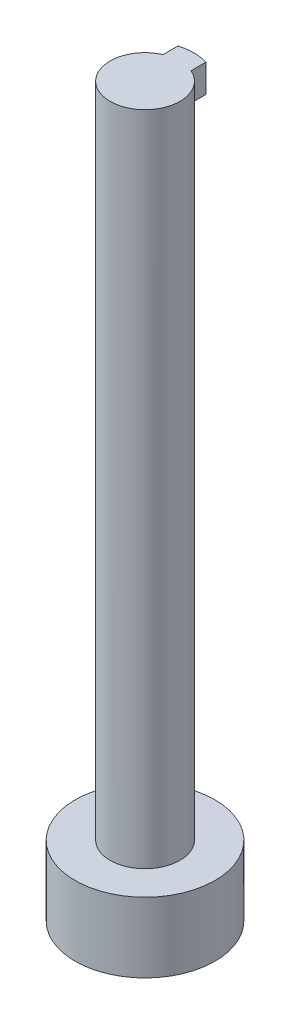
ISO-10303-21;
HEADER;
FILE_DESCRIPTION(('STEP AP214'),'2;1');
FILE_NAME('part.step','',(''),(''),'','','');
FILE_SCHEMA(('AUTOMOTIVE_DESIGN { 1 0 10303 214 1 1 1 1 }'));
ENDSEC;
DATA;
#1=APPLICATION_CONTEXT('core data for automotive mechanical design processes');
#2=APPLICATION_PROTOCOL_DEFINITION('international standard','automotive_design',2000,#1);
#3=PRODUCT_CONTEXT('',#1,'mechanical');
#4=PRODUCT('Part','Part','',(#3));
#5=PRODUCT_RELATED_PRODUCT_CATEGORY('part','',(#4));
#6=PRODUCT_DEFINITION_FORMATION('','',#4);
#7=PRODUCT_DEFINITION_CONTEXT('part definition',#1,'design');
#8=PRODUCT_DEFINITION('design','',#6,#7);
#9=PRODUCT_DEFINITION_SHAPE('','',#8);
#10=(LENGTH_UNIT() NAMED_UNIT(*) SI_UNIT(.MILLI.,.METRE.));
#11=(NAMED_UNIT(*) PLANE_ANGLE_UNIT() SI_UNIT($,.RADIAN.));
#12=(NAMED_UNIT(*) SI_UNIT($,.STERADIAN.) SOLID_ANGLE_UNIT());
#13=UNCERTAINTY_MEASURE_WITH_UNIT(LENGTH_MEASURE(1.E-05),#10,'distance_accuracy_value','');
#14=(GEOMETRIC_REPRESENTATION_CONTEXT(3) GLOBAL_UNCERTAINTY_ASSIGNED_CONTEXT((#13)) GLOBAL_UNIT_ASSIGNED_CONTEXT((#10,
#11,#12)) REPRESENTATION_CONTEXT('',''));
#15=CARTESIAN_POINT('',(0.,0.,0.));
#16=DIRECTION('',(0.,0.,1.));
#17=DIRECTION('',(1.,0.,0.));
#18=AXIS2_PLACEMENT_3D('',#15,#16,#17);
#19=CARTESIAN_POINT('',(0.,66.04,0.));
#20=DIRECTION('',(0.,-1.,0.));
#21=DIRECTION('',(0.,0.,-1.));
#22=AXIS2_PLACEMENT_3D('',#19,#20,#21);
#23=CYLINDRICAL_SURFACE('',#22,3.175);
#24=CARTESIAN_POINT('',(0.,63.5,0.));
#25=DIRECTION('',(0.,-1.,0.));
#26=DIRECTION('',(0.,0.,1.));
#27=AXIS2_PLACEMENT_3D('',#24,#25,#26);
#28=CIRCLE('',#27,3.175);
#29=CARTESIAN_POINT('',(-1.27,63.5,-2.90993556629696));
#30=VERTEX_POINT('',#29);
#31=CARTESIAN_POINT('',(1.27,63.5,-2.90993556629696));
#32=VERTEX_POINT('',#31);
#33=EDGE_CURVE('E93',#30,#32,#28,.T.);
#34=ORIENTED_EDGE('',*,*,#33,.T.);
#35=DIRECTION('',(0.,1.,0.));
#36=VECTOR('',#35,1.);
#37=CARTESIAN_POINT('',(1.27,63.5,-2.90993556629696));
#38=LINE('',#37,#36);
#39=CARTESIAN_POINT('',(1.27,66.04,-2.90993556629696));
#40=VERTEX_POINT('',#39);
#41=EDGE_CURVE('E107',#32,#40,#38,.T.);
#42=ORIENTED_EDGE('',*,*,#41,.T.);
#43=CARTESIAN_POINT('',(0.,66.04,0.));
#44=DIRECTION('',(0.,1.,0.));
#45=DIRECTION('',(0.,0.,1.));
#46=AXIS2_PLACEMENT_3D('',#43,#44,#45);
#47=CIRCLE('',#46,3.175);
#48=CARTESIAN_POINT('',(-1.27,66.04,-2.90993556629696));
#49=VERTEX_POINT('',#48);
#50=EDGE_CURVE('E51',#49,#40,#47,.T.);
#51=ORIENTED_EDGE('',*,*,#50,.F.);
#52=DIRECTION('',(0.,1.,0.));
#53=VECTOR('',#52,1.);
#54=CARTESIAN_POINT('',(-1.27,63.5,-2.90993556629696));
#55=LINE('',#54,#53);
#56=EDGE_CURVE('E102',#30,#49,#55,.T.);
#57=ORIENTED_EDGE('',*,*,#56,.F.);
#58=EDGE_LOOP('',(#34,#42,#51,#57));
#59=FACE_BOUND('',#58,.T.);
#60=CARTESIAN_POINT('',(0.,6.35,0.));
#61=DIRECTION('',(0.,-1.,0.));
#62=DIRECTION('',(0.,0.,-1.));
#63=AXIS2_PLACEMENT_3D('',#60,#61,#62);
#64=CIRCLE('',#63,3.175);
#65=CARTESIAN_POINT('',(0.,6.35,-3.175));
#66=VERTEX_POINT('',#65);
#67=EDGE_CURVE('E13',#66,#66,#64,.T.);
#68=ORIENTED_EDGE('',*,*,#67,.F.);
#69=EDGE_LOOP('',(#68));
#70=FACE_BOUND('',#69,.T.);
#71=ADVANCED_FACE('F44',(#59,#70),#23,.T.);
#72=CARTESIAN_POINT('',(0.,66.04,0.));
#73=DIRECTION('',(0.,1.,0.));
#74=DIRECTION('',(0.,0.,1.));
#75=AXIS2_PLACEMENT_3D('',#72,#73,#74);
#76=PLANE('',#75);
#77=ORIENTED_EDGE('',*,*,#50,.T.);
#78=DIRECTION('',(0.,0.,-1.));
#79=VECTOR('',#78,1.);
#80=CARTESIAN_POINT('',(1.27,66.04,-4.2597094971371));
#81=LINE('',#80,#79);
#82=CARTESIAN_POINT('',(1.27,66.04,-4.2597094971371));
#83=VERTEX_POINT('',#82);
#84=EDGE_CURVE('E114',#40,#83,#81,.T.);
#85=ORIENTED_EDGE('',*,*,#84,.T.);
#86=CARTESIAN_POINT('',(0.,66.04,0.));
#87=DIRECTION('',(0.,1.,0.));
#88=DIRECTION('',(0.,0.,1.));
#89=AXIS2_PLACEMENT_3D('',#86,#87,#88);
#90=CIRCLE('',#89,4.445);
#91=CARTESIAN_POINT('',(-1.27,66.04,-4.2597094971371));
#92=VERTEX_POINT('',#91);
#93=EDGE_CURVE('E117',#83,#92,#90,.T.);
#94=ORIENTED_EDGE('',*,*,#93,.T.);
#95=DIRECTION('',(0.,0.,1.));
#96=VECTOR('',#95,1.);
#97=CARTESIAN_POINT('',(-1.27,66.04,-4.2597094971371));
#98=LINE('',#97,#96);
#99=EDGE_CURVE('E58',#92,#49,#98,.T.);
#100=ORIENTED_EDGE('',*,*,#99,.T.);
#101=EDGE_LOOP('',(#77,#85,#94,#100));
#102=FACE_BOUND('',#101,.T.);
#103=ADVANCED_FACE('F143',(#102),#76,.T.);
#104=CARTESIAN_POINT('',(0.,63.5,0.));
#105=DIRECTION('',(0.,1.,0.));
#106=DIRECTION('',(0.,0.,1.));
#107=AXIS2_PLACEMENT_3D('',#104,#105,#106);
#108=CYLINDRICAL_SURFACE('',#107,4.445);
#109=ORIENTED_EDGE('',*,*,#93,.F.);
#110=DIRECTION('',(0.,1.,0.));
#111=VECTOR('',#110,1.);
#112=CARTESIAN_POINT('',(1.27,63.5,-4.2597094971371));
#113=LINE('',#112,#111);
#114=CARTESIAN_POINT('',(1.27,63.5,-4.2597094971371));
#115=VERTEX_POINT('',#114);
#116=EDGE_CURVE('E67',#115,#83,#113,.T.);
#117=ORIENTED_EDGE('',*,*,#116,.F.);
#118=CARTESIAN_POINT('',(0.,63.5,0.));
#119=DIRECTION('',(0.,1.,0.));
#120=DIRECTION('',(0.,0.,1.));
#121=AXIS2_PLACEMENT_3D('',#118,#119,#120);
#122=CIRCLE('',#121,4.445);
#123=CARTESIAN_POINT('',(-1.27,63.5,-4.2597094971371));
#124=VERTEX_POINT('',#123);
#125=EDGE_CURVE('E104',#115,#124,#122,.T.);
#126=ORIENTED_EDGE('',*,*,#125,.T.);
#127=DIRECTION('',(0.,1.,0.));
#128=VECTOR('',#127,1.);
#129=CARTESIAN_POINT('',(-1.27,63.5,-4.2597094971371));
#130=LINE('',#129,#128);
#131=EDGE_CURVE('E87',#124,#92,#130,.T.);
#132=ORIENTED_EDGE('',*,*,#131,.T.);
#133=EDGE_LOOP('',(#109,#117,#126,#132));
#134=FACE_BOUND('',#133,.T.);
#135=ADVANCED_FACE('F147',(#134),#108,.T.);
#136=CARTESIAN_POINT('',(1.27,63.5,-4.2597094971371));
#137=DIRECTION('',(1.,0.,0.));
#138=DIRECTION('',(0.,0.,-1.));
#139=AXIS2_PLACEMENT_3D('',#136,#137,#138);
#140=PLANE('',#139);
#141=ORIENTED_EDGE('',*,*,#84,.F.);
#142=ORIENTED_EDGE('',*,*,#41,.F.);
#143=DIRECTION('',(0.,0.,-1.));
#144=VECTOR('',#143,1.);
#145=CARTESIAN_POINT('',(1.27,63.5,-4.2597094971371));
#146=LINE('',#145,#144);
#147=EDGE_CURVE('E96',#32,#115,#146,.T.);
#148=ORIENTED_EDGE('',*,*,#147,.T.);
#149=ORIENTED_EDGE('',*,*,#116,.T.);
#150=EDGE_LOOP('',(#141,#142,#148,#149));
#151=FACE_BOUND('',#150,.T.);
#152=ADVANCED_FACE('F152',(#151),#140,.T.);
#153=CARTESIAN_POINT('',(-1.27,63.5,-4.2597094971371));
#154=DIRECTION('',(-1.,0.,0.));
#155=DIRECTION('',(0.,0.,1.));
#156=AXIS2_PLACEMENT_3D('',#153,#154,#155);
#157=PLANE('',#156);
#158=ORIENTED_EDGE('',*,*,#99,.F.);
#159=ORIENTED_EDGE('',*,*,#131,.F.);
#160=DIRECTION('',(0.,0.,1.));
#161=VECTOR('',#160,1.);
#162=CARTESIAN_POINT('',(-1.27,63.5,-4.2597094971371));
#163=LINE('',#162,#161);
#164=EDGE_CURVE('E95',#124,#30,#163,.T.);
#165=ORIENTED_EDGE('',*,*,#164,.T.);
#166=ORIENTED_EDGE('',*,*,#56,.T.);
#167=EDGE_LOOP('',(#158,#159,#165,#166));
#168=FACE_BOUND('',#167,.T.);
#169=ADVANCED_FACE('F101',(#168),#157,.T.);
#170=CARTESIAN_POINT('',(0.,63.5,0.));
#171=DIRECTION('',(0.,1.,0.));
#172=DIRECTION('',(0.,0.,1.));
#173=AXIS2_PLACEMENT_3D('',#170,#171,#172);
#174=PLANE('',#173);
#175=ORIENTED_EDGE('',*,*,#125,.F.);
#176=ORIENTED_EDGE('',*,*,#147,.F.);
#177=ORIENTED_EDGE('',*,*,#33,.F.);
#178=ORIENTED_EDGE('',*,*,#164,.F.);
#179=EDGE_LOOP('',(#175,#176,#177,#178));
#180=FACE_BOUND('',#179,.T.);
#181=ADVANCED_FACE('F94',(#180),#174,.F.);
#182=CARTESIAN_POINT('',(0.,6.35,0.));
#183=DIRECTION('',(0.,-1.,0.));
#184=DIRECTION('',(0.,0.,-1.));
#185=AXIS2_PLACEMENT_3D('',#182,#183,#184);
#186=CYLINDRICAL_SURFACE('',#185,6.35);
#187=CARTESIAN_POINT('',(0.,6.35,0.));
#188=DIRECTION('',(0.,-1.,0.));
#189=DIRECTION('',(0.,0.,-1.));
#190=AXIS2_PLACEMENT_3D('',#187,#188,#189);
#191=CIRCLE('',#190,6.35);
#192=CARTESIAN_POINT('',(0.,6.35,-6.35));
#193=VERTEX_POINT('',#192);
#194=EDGE_CURVE('E119',#193,#193,#191,.T.);
#195=ORIENTED_EDGE('',*,*,#194,.T.);
#196=EDGE_LOOP('',(#195));
#197=FACE_BOUND('',#196,.T.);
#198=CARTESIAN_POINT('',(0.,0.,0.));
#199=DIRECTION('',(0.,-1.,0.));
#200=DIRECTION('',(0.,0.,-1.));
#201=AXIS2_PLACEMENT_3D('',#198,#199,#200);
#202=CIRCLE('',#201,6.35);
#203=CARTESIAN_POINT('',(0.,0.,-6.35));
#204=VERTEX_POINT('',#203);
#205=EDGE_CURVE('E122',#204,#204,#202,.T.);
#206=ORIENTED_EDGE('',*,*,#205,.F.);
#207=EDGE_LOOP('',(#206));
#208=FACE_BOUND('',#207,.T.);
#209=ADVANCED_FACE('F128',(#197,#208),#186,.T.);
#210=CARTESIAN_POINT('',(0.,6.35,0.));
#211=DIRECTION('',(0.,-1.,0.));
#212=DIRECTION('',(0.,0.,-1.));
#213=AXIS2_PLACEMENT_3D('',#210,#211,#212);
#214=PLANE('',#213);
#215=ORIENTED_EDGE('',*,*,#67,.T.);
#216=EDGE_LOOP('',(#215));
#217=FACE_BOUND('',#216,.T.);
#218=ORIENTED_EDGE('',*,*,#194,.F.);
#219=EDGE_LOOP('',(#218));
#220=FACE_BOUND('',#219,.T.);
#221=ADVANCED_FACE('F131',(#217,#220),#214,.F.);
#222=CARTESIAN_POINT('',(0.,0.,0.));
#223=DIRECTION('',(0.,1.,0.));
#224=DIRECTION('',(0.,0.,1.));
#225=AXIS2_PLACEMENT_3D('',#222,#223,#224);
#226=PLANE('',#225);
#227=ORIENTED_EDGE('',*,*,#205,.T.);
#228=EDGE_LOOP('',(#227));
#229=FACE_BOUND('',#228,.T.);
#230=ADVANCED_FACE('F133',(#229),#226,.F.);
#231=CLOSED_SHELL('',(#71,#103,#135,#152,#169,#181,#209,#221,#230));
#232=MANIFOLD_SOLID_BREP('B2',#231);
#233=ADVANCED_BREP_SHAPE_REPRESENTATION('',(#18,#232),#14);
#234=SHAPE_DEFINITION_REPRESENTATION(#9,#233);
ENDSEC;
END-ISO-10303-21;
